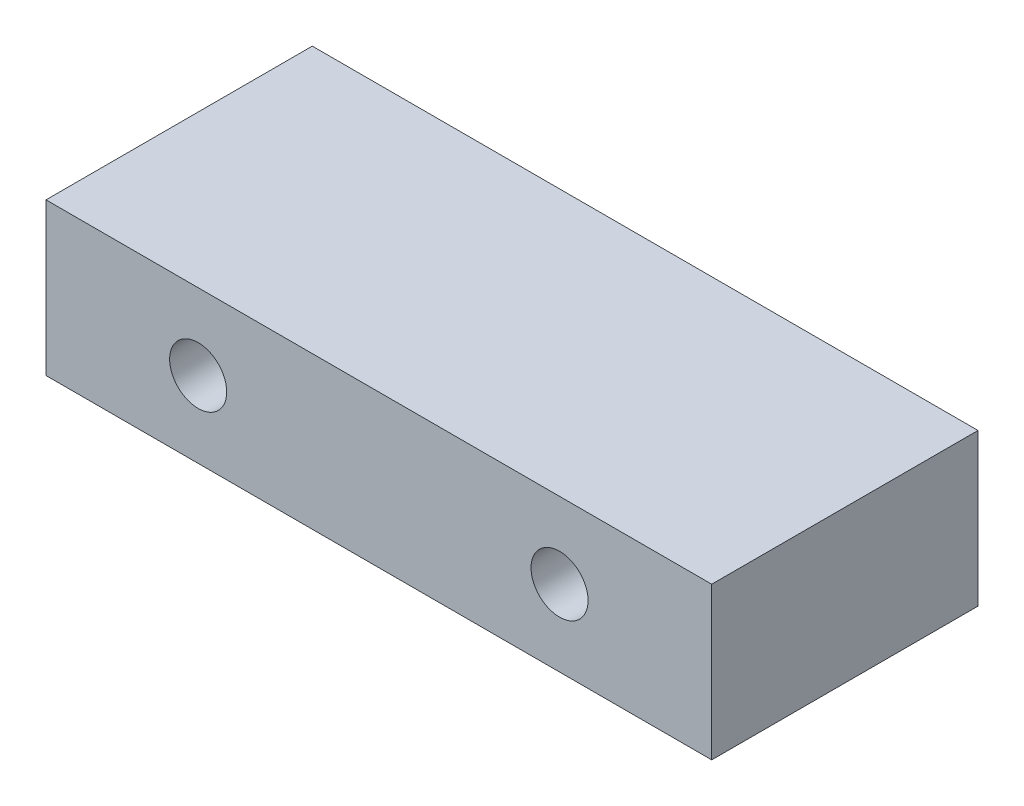
ISO-10303-21;
HEADER;
FILE_DESCRIPTION(('STEP AP214'),'2;1');
FILE_NAME('part.step','',(''),(''),'','','');
FILE_SCHEMA(('AUTOMOTIVE_DESIGN { 1 0 10303 214 1 1 1 1 }'));
ENDSEC;
DATA;
#1=APPLICATION_CONTEXT('core data for automotive mechanical design processes');
#2=APPLICATION_PROTOCOL_DEFINITION('international standard','automotive_design',2000,#1);
#3=PRODUCT_CONTEXT('',#1,'mechanical');
#4=PRODUCT('Part','Part','',(#3));
#5=PRODUCT_RELATED_PRODUCT_CATEGORY('part','',(#4));
#6=PRODUCT_DEFINITION_FORMATION('','',#4);
#7=PRODUCT_DEFINITION_CONTEXT('part definition',#1,'design');
#8=PRODUCT_DEFINITION('design','',#6,#7);
#9=PRODUCT_DEFINITION_SHAPE('','',#8);
#10=(LENGTH_UNIT() NAMED_UNIT(*) SI_UNIT(.MILLI.,.METRE.));
#11=(NAMED_UNIT(*) PLANE_ANGLE_UNIT() SI_UNIT($,.RADIAN.));
#12=(NAMED_UNIT(*) SI_UNIT($,.STERADIAN.) SOLID_ANGLE_UNIT());
#13=UNCERTAINTY_MEASURE_WITH_UNIT(LENGTH_MEASURE(1.E-05),#10,'distance_accuracy_value','');
#14=(GEOMETRIC_REPRESENTATION_CONTEXT(3) GLOBAL_UNCERTAINTY_ASSIGNED_CONTEXT((#13)) GLOBAL_UNIT_ASSIGNED_CONTEXT((#10,
#11,#12)) REPRESENTATION_CONTEXT('',''));
#15=CARTESIAN_POINT('',(0.,0.,0.));
#16=DIRECTION('',(0.,0.,1.));
#17=DIRECTION('',(1.,0.,0.));
#18=AXIS2_PLACEMENT_3D('',#15,#16,#17);
#19=CARTESIAN_POINT('',(8.75,2.,-7.));
#20=DIRECTION('',(1.,0.,0.));
#21=DIRECTION('',(0.,0.,-1.));
#22=AXIS2_PLACEMENT_3D('',#19,#20,#21);
#23=PLANE('',#22);
#24=DIRECTION('',(0.,1.,0.));
#25=VECTOR('',#24,1.);
#26=CARTESIAN_POINT('',(8.75,2.,0.));
#27=LINE('',#26,#25);
#28=CARTESIAN_POINT('',(8.75,-2.,0.));
#29=VERTEX_POINT('',#28);
#30=CARTESIAN_POINT('',(8.75,2.,0.));
#31=VERTEX_POINT('',#30);
#32=EDGE_CURVE('E99',#29,#31,#27,.T.);
#33=ORIENTED_EDGE('',*,*,#32,.F.);
#34=DIRECTION('',(0.,0.,1.));
#35=VECTOR('',#34,1.);
#36=CARTESIAN_POINT('',(8.75,-2.,-7.));
#37=LINE('',#36,#35);
#38=CARTESIAN_POINT('',(8.75,-2.,-7.));
#39=VERTEX_POINT('',#38);
#40=EDGE_CURVE('E11',#39,#29,#37,.T.);
#41=ORIENTED_EDGE('',*,*,#40,.F.);
#42=DIRECTION('',(0.,1.,0.));
#43=VECTOR('',#42,1.);
#44=CARTESIAN_POINT('',(8.75,2.,-7.));
#45=LINE('',#44,#43);
#46=CARTESIAN_POINT('',(8.75,2.,-7.));
#47=VERTEX_POINT('',#46);
#48=EDGE_CURVE('E92',#39,#47,#45,.T.);
#49=ORIENTED_EDGE('',*,*,#48,.T.);
#50=DIRECTION('',(0.,0.,1.));
#51=VECTOR('',#50,1.);
#52=CARTESIAN_POINT('',(8.75,2.,-7.));
#53=LINE('',#52,#51);
#54=EDGE_CURVE('E37',#47,#31,#53,.T.);
#55=ORIENTED_EDGE('',*,*,#54,.T.);
#56=EDGE_LOOP('',(#33,#41,#49,#55));
#57=FACE_BOUND('',#56,.T.);
#58=ADVANCED_FACE('F34',(#57),#23,.T.);
#59=CARTESIAN_POINT('',(-8.75,-2.,-7.));
#60=DIRECTION('',(0.,-1.,0.));
#61=DIRECTION('',(0.,0.,-1.));
#62=AXIS2_PLACEMENT_3D('',#59,#60,#61);
#63=PLANE('',#62);
#64=DIRECTION('',(1.,0.,0.));
#65=VECTOR('',#64,1.);
#66=CARTESIAN_POINT('',(-8.75,-2.,0.));
#67=LINE('',#66,#65);
#68=CARTESIAN_POINT('',(-8.75,-2.,0.));
#69=VERTEX_POINT('',#68);
#70=EDGE_CURVE('E94',#69,#29,#67,.T.);
#71=ORIENTED_EDGE('',*,*,#70,.F.);
#72=DIRECTION('',(0.,0.,1.));
#73=VECTOR('',#72,1.);
#74=CARTESIAN_POINT('',(-8.75,-2.,-7.));
#75=LINE('',#74,#73);
#76=CARTESIAN_POINT('',(-8.75,-2.,-7.));
#77=VERTEX_POINT('',#76);
#78=EDGE_CURVE('E43',#77,#69,#75,.T.);
#79=ORIENTED_EDGE('',*,*,#78,.F.);
#80=DIRECTION('',(1.,0.,0.));
#81=VECTOR('',#80,1.);
#82=CARTESIAN_POINT('',(-8.75,-2.,-7.));
#83=LINE('',#82,#81);
#84=EDGE_CURVE('E89',#77,#39,#83,.T.);
#85=ORIENTED_EDGE('',*,*,#84,.T.);
#86=ORIENTED_EDGE('',*,*,#40,.T.);
#87=EDGE_LOOP('',(#71,#79,#85,#86));
#88=FACE_BOUND('',#87,.T.);
#89=ADVANCED_FACE('F110',(#88),#63,.T.);
#90=CARTESIAN_POINT('',(-8.75,2.,-7.));
#91=DIRECTION('',(-1.,0.,0.));
#92=DIRECTION('',(0.,-1.,0.));
#93=AXIS2_PLACEMENT_3D('',#90,#91,#92);
#94=PLANE('',#93);
#95=DIRECTION('',(0.,-1.,0.));
#96=VECTOR('',#95,1.);
#97=CARTESIAN_POINT('',(-8.75,2.,0.));
#98=LINE('',#97,#96);
#99=CARTESIAN_POINT('',(-8.75,2.,0.));
#100=VERTEX_POINT('',#99);
#101=EDGE_CURVE('E84',#100,#69,#98,.T.);
#102=ORIENTED_EDGE('',*,*,#101,.F.);
#103=DIRECTION('',(0.,0.,1.));
#104=VECTOR('',#103,1.);
#105=CARTESIAN_POINT('',(-8.75,2.,-7.));
#106=LINE('',#105,#104);
#107=CARTESIAN_POINT('',(-8.75,2.,-7.));
#108=VERTEX_POINT('',#107);
#109=EDGE_CURVE('E79',#108,#100,#106,.T.);
#110=ORIENTED_EDGE('',*,*,#109,.F.);
#111=DIRECTION('',(0.,-1.,0.));
#112=VECTOR('',#111,1.);
#113=CARTESIAN_POINT('',(-8.75,2.,-7.));
#114=LINE('',#113,#112);
#115=EDGE_CURVE('E82',#108,#77,#114,.T.);
#116=ORIENTED_EDGE('',*,*,#115,.T.);
#117=ORIENTED_EDGE('',*,*,#78,.T.);
#118=EDGE_LOOP('',(#102,#110,#116,#117));
#119=FACE_BOUND('',#118,.T.);
#120=ADVANCED_FACE('F81',(#119),#94,.T.);
#121=CARTESIAN_POINT('',(-8.75,2.,-7.));
#122=DIRECTION('',(0.,1.,0.));
#123=DIRECTION('',(0.,0.,1.));
#124=AXIS2_PLACEMENT_3D('',#121,#122,#123);
#125=PLANE('',#124);
#126=DIRECTION('',(-1.,0.,0.));
#127=VECTOR('',#126,1.);
#128=CARTESIAN_POINT('',(-8.75,2.,0.));
#129=LINE('',#128,#127);
#130=EDGE_CURVE('E102',#31,#100,#129,.T.);
#131=ORIENTED_EDGE('',*,*,#130,.F.);
#132=ORIENTED_EDGE('',*,*,#54,.F.);
#133=DIRECTION('',(-1.,0.,0.));
#134=VECTOR('',#133,1.);
#135=CARTESIAN_POINT('',(-8.75,2.,-7.));
#136=LINE('',#135,#134);
#137=EDGE_CURVE('E88',#47,#108,#136,.T.);
#138=ORIENTED_EDGE('',*,*,#137,.T.);
#139=ORIENTED_EDGE('',*,*,#109,.T.);
#140=EDGE_LOOP('',(#131,#132,#138,#139));
#141=FACE_BOUND('',#140,.T.);
#142=ADVANCED_FACE('F91',(#141),#125,.T.);
#143=CARTESIAN_POINT('',(0.,0.,-7.));
#144=DIRECTION('',(0.,0.,1.));
#145=DIRECTION('',(1.,0.,0.));
#146=AXIS2_PLACEMENT_3D('',#143,#144,#145);
#147=PLANE('',#146);
#148=CARTESIAN_POINT('',(4.75,0.,-7.));
#149=DIRECTION('',(0.,0.,1.));
#150=DIRECTION('',(1.,0.,0.));
#151=AXIS2_PLACEMENT_3D('',#148,#149,#150);
#152=CIRCLE('',#151,0.75);
#153=CARTESIAN_POINT('',(5.5,0.,-7.));
#154=VERTEX_POINT('',#153);
#155=EDGE_CURVE('E103',#154,#154,#152,.F.);
#156=ORIENTED_EDGE('',*,*,#155,.F.);
#157=EDGE_LOOP('',(#156));
#158=FACE_BOUND('',#157,.T.);
#159=CARTESIAN_POINT('',(-4.75,0.,-7.));
#160=DIRECTION('',(0.,0.,1.));
#161=DIRECTION('',(1.,0.,0.));
#162=AXIS2_PLACEMENT_3D('',#159,#160,#161);
#163=CIRCLE('',#162,0.75);
#164=CARTESIAN_POINT('',(-4.,0.,-7.));
#165=VERTEX_POINT('',#164);
#166=EDGE_CURVE('E150',#165,#165,#163,.F.);
#167=ORIENTED_EDGE('',*,*,#166,.F.);
#168=EDGE_LOOP('',(#167));
#169=FACE_BOUND('',#168,.T.);
#170=ORIENTED_EDGE('',*,*,#48,.F.);
#171=ORIENTED_EDGE('',*,*,#84,.F.);
#172=ORIENTED_EDGE('',*,*,#115,.F.);
#173=ORIENTED_EDGE('',*,*,#137,.F.);
#174=EDGE_LOOP('',(#170,#171,#172,#173));
#175=FACE_BOUND('',#174,.T.);
#176=ADVANCED_FACE('F87',(#158,#169,#175),#147,.F.);
#177=CARTESIAN_POINT('',(0.,0.,0.));
#178=DIRECTION('',(0.,0.,1.));
#179=DIRECTION('',(1.,0.,0.));
#180=AXIS2_PLACEMENT_3D('',#177,#178,#179);
#181=PLANE('',#180);
#182=CARTESIAN_POINT('',(4.75,0.,0.));
#183=DIRECTION('',(0.,0.,1.));
#184=DIRECTION('',(1.,0.,0.));
#185=AXIS2_PLACEMENT_3D('',#182,#183,#184);
#186=CIRCLE('',#185,0.75);
#187=CARTESIAN_POINT('',(5.5,0.,0.));
#188=VERTEX_POINT('',#187);
#189=EDGE_CURVE('E144',#188,#188,#186,.T.);
#190=ORIENTED_EDGE('',*,*,#189,.F.);
#191=EDGE_LOOP('',(#190));
#192=FACE_BOUND('',#191,.T.);
#193=CARTESIAN_POINT('',(-4.75,0.,0.));
#194=DIRECTION('',(0.,0.,1.));
#195=DIRECTION('',(1.,0.,0.));
#196=AXIS2_PLACEMENT_3D('',#193,#194,#195);
#197=CIRCLE('',#196,0.75);
#198=CARTESIAN_POINT('',(-4.,0.,0.));
#199=VERTEX_POINT('',#198);
#200=EDGE_CURVE('E147',#199,#199,#197,.T.);
#201=ORIENTED_EDGE('',*,*,#200,.F.);
#202=EDGE_LOOP('',(#201));
#203=FACE_BOUND('',#202,.T.);
#204=ORIENTED_EDGE('',*,*,#32,.T.);
#205=ORIENTED_EDGE('',*,*,#130,.T.);
#206=ORIENTED_EDGE('',*,*,#101,.T.);
#207=ORIENTED_EDGE('',*,*,#70,.T.);
#208=EDGE_LOOP('',(#204,#205,#206,#207));
#209=FACE_BOUND('',#208,.T.);
#210=ADVANCED_FACE('F109',(#192,#203,#209),#181,.T.);
#211=CARTESIAN_POINT('',(-4.75,0.,-7.001));
#212=DIRECTION('',(0.,0.,1.));
#213=DIRECTION('',(1.,0.,0.));
#214=AXIS2_PLACEMENT_3D('',#211,#212,#213);
#215=CYLINDRICAL_SURFACE('',#214,0.75);
#216=ORIENTED_EDGE('',*,*,#200,.T.);
#217=EDGE_LOOP('',(#216));
#218=FACE_BOUND('',#217,.T.);
#219=ORIENTED_EDGE('',*,*,#166,.T.);
#220=EDGE_LOOP('',(#219));
#221=FACE_BOUND('',#220,.T.);
#222=ADVANCED_FACE('F128',(#218,#221),#215,.F.);
#223=CARTESIAN_POINT('',(4.75,0.,-7.001));
#224=DIRECTION('',(0.,0.,1.));
#225=DIRECTION('',(1.,0.,0.));
#226=AXIS2_PLACEMENT_3D('',#223,#224,#225);
#227=CYLINDRICAL_SURFACE('',#226,0.75);
#228=ORIENTED_EDGE('',*,*,#189,.T.);
#229=EDGE_LOOP('',(#228));
#230=FACE_BOUND('',#229,.T.);
#231=ORIENTED_EDGE('',*,*,#155,.T.);
#232=EDGE_LOOP('',(#231));
#233=FACE_BOUND('',#232,.T.);
#234=ADVANCED_FACE('F135',(#230,#233),#227,.F.);
#235=CLOSED_SHELL('',(#58,#89,#120,#142,#176,#210,#222,#234));
#236=MANIFOLD_SOLID_BREP('B2',#235);
#237=ADVANCED_BREP_SHAPE_REPRESENTATION('',(#18,#236),#14);
#238=SHAPE_DEFINITION_REPRESENTATION(#9,#237);
ENDSEC;
END-ISO-10303-21;
